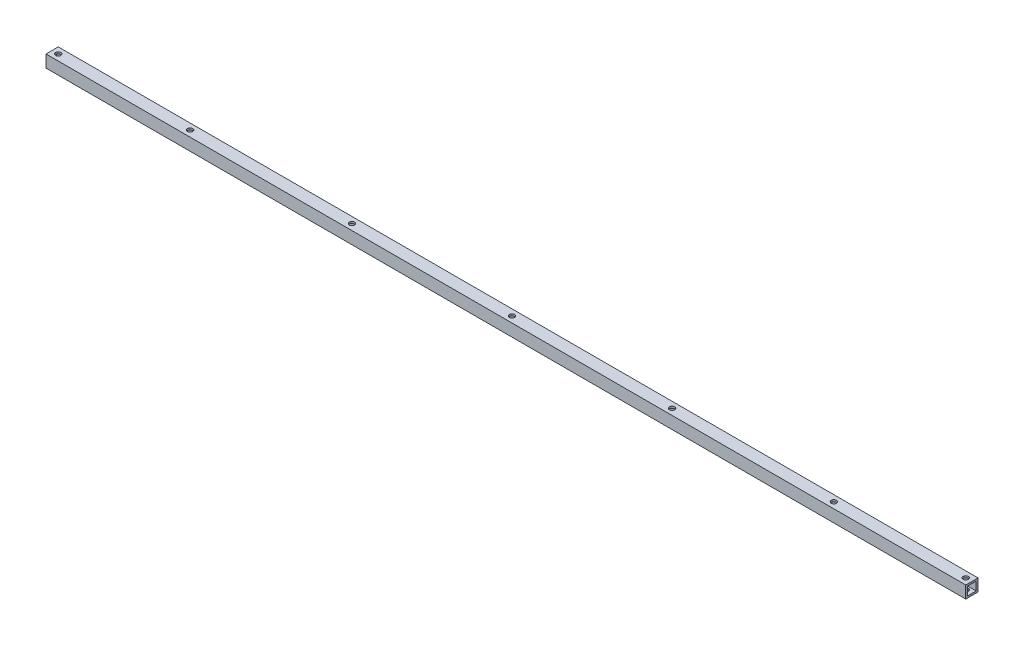
ISO-10303-21;
HEADER;
FILE_DESCRIPTION(('STEP AP214'),'2;1');
FILE_NAME('part.step','',(''),(''),'','','');
FILE_SCHEMA(('AUTOMOTIVE_DESIGN { 1 0 10303 214 1 1 1 1 }'));
ENDSEC;
DATA;
#1=APPLICATION_CONTEXT('core data for automotive mechanical design processes');
#2=APPLICATION_PROTOCOL_DEFINITION('international standard','automotive_design',2000,#1);
#3=PRODUCT_CONTEXT('',#1,'mechanical');
#4=PRODUCT('Part','Part','',(#3));
#5=PRODUCT_RELATED_PRODUCT_CATEGORY('part','',(#4));
#6=PRODUCT_DEFINITION_FORMATION('','',#4);
#7=PRODUCT_DEFINITION_CONTEXT('part definition',#1,'design');
#8=PRODUCT_DEFINITION('design','',#6,#7);
#9=PRODUCT_DEFINITION_SHAPE('','',#8);
#10=(LENGTH_UNIT() NAMED_UNIT(*) SI_UNIT(.MILLI.,.METRE.));
#11=(NAMED_UNIT(*) PLANE_ANGLE_UNIT() SI_UNIT($,.RADIAN.));
#12=(NAMED_UNIT(*) SI_UNIT($,.STERADIAN.) SOLID_ANGLE_UNIT());
#13=UNCERTAINTY_MEASURE_WITH_UNIT(LENGTH_MEASURE(1.E-05),#10,'distance_accuracy_value','');
#14=(GEOMETRIC_REPRESENTATION_CONTEXT(3) GLOBAL_UNCERTAINTY_ASSIGNED_CONTEXT((#13)) GLOBAL_UNIT_ASSIGNED_CONTEXT((#10,
#11,#12)) REPRESENTATION_CONTEXT('',''));
#15=CARTESIAN_POINT('',(0.,0.,0.));
#16=DIRECTION('',(0.,0.,1.));
#17=DIRECTION('',(1.,0.,0.));
#18=AXIS2_PLACEMENT_3D('',#15,#16,#17);
#19=CARTESIAN_POINT('',(750.,0.,0.));
#20=DIRECTION('',(1.,0.,0.));
#21=DIRECTION('',(0.,0.,-1.));
#22=AXIS2_PLACEMENT_3D('',#19,#20,#21);
#23=PLANE('',#22);
#24=DIRECTION('',(0.,1.,0.));
#25=VECTOR('',#24,1.);
#26=CARTESIAN_POINT('',(750.,5.,-5.));
#27=LINE('',#26,#25);
#28=CARTESIAN_POINT('',(750.,-5.,-5.));
#29=VERTEX_POINT('',#28);
#30=CARTESIAN_POINT('',(750.,5.,-5.));
#31=VERTEX_POINT('',#30);
#32=EDGE_CURVE('E164',#29,#31,#27,.T.);
#33=ORIENTED_EDGE('',*,*,#32,.T.);
#34=DIRECTION('',(0.,0.,1.));
#35=VECTOR('',#34,1.);
#36=CARTESIAN_POINT('',(750.,5.,5.));
#37=LINE('',#36,#35);
#38=CARTESIAN_POINT('',(750.,5.,5.));
#39=VERTEX_POINT('',#38);
#40=EDGE_CURVE('E167',#31,#39,#37,.T.);
#41=ORIENTED_EDGE('',*,*,#40,.T.);
#42=DIRECTION('',(0.,-1.,0.));
#43=VECTOR('',#42,1.);
#44=CARTESIAN_POINT('',(750.,5.,5.));
#45=LINE('',#44,#43);
#46=CARTESIAN_POINT('',(750.,-5.,5.));
#47=VERTEX_POINT('',#46);
#48=EDGE_CURVE('E170',#39,#47,#45,.T.);
#49=ORIENTED_EDGE('',*,*,#48,.T.);
#50=DIRECTION('',(0.,0.,-1.));
#51=VECTOR('',#50,1.);
#52=CARTESIAN_POINT('',(750.,-5.,5.));
#53=LINE('',#52,#51);
#54=EDGE_CURVE('E172',#47,#29,#53,.T.);
#55=ORIENTED_EDGE('',*,*,#54,.T.);
#56=EDGE_LOOP('',(#33,#41,#49,#55));
#57=FACE_BOUND('',#56,.T.);
#58=DIRECTION('',(0.,0.,1.));
#59=VECTOR('',#58,1.);
#60=CARTESIAN_POINT('',(750.,3.5,5.));
#61=LINE('',#60,#59);
#62=CARTESIAN_POINT('',(750.,3.5,-3.5));
#63=VERTEX_POINT('',#62);
#64=CARTESIAN_POINT('',(750.,3.5,3.5));
#65=VERTEX_POINT('',#64);
#66=EDGE_CURVE('E134',#63,#65,#61,.T.);
#67=ORIENTED_EDGE('',*,*,#66,.F.);
#68=DIRECTION('',(0.,1.,0.));
#69=VECTOR('',#68,1.);
#70=CARTESIAN_POINT('',(750.,5.,-3.5));
#71=LINE('',#70,#69);
#72=CARTESIAN_POINT('',(750.,-3.5,-3.5));
#73=VERTEX_POINT('',#72);
#74=EDGE_CURVE('E126',#73,#63,#71,.T.);
#75=ORIENTED_EDGE('',*,*,#74,.F.);
#76=DIRECTION('',(0.,0.,-1.));
#77=VECTOR('',#76,1.);
#78=CARTESIAN_POINT('',(750.,-3.5,5.));
#79=LINE('',#78,#77);
#80=CARTESIAN_POINT('',(750.,-3.5,3.5));
#81=VERTEX_POINT('',#80);
#82=EDGE_CURVE('E148',#81,#73,#79,.T.);
#83=ORIENTED_EDGE('',*,*,#82,.F.);
#84=DIRECTION('',(0.,-1.,0.));
#85=VECTOR('',#84,1.);
#86=CARTESIAN_POINT('',(750.,5.,3.5));
#87=LINE('',#86,#85);
#88=EDGE_CURVE('E146',#65,#81,#87,.T.);
#89=ORIENTED_EDGE('',*,*,#88,.F.);
#90=EDGE_LOOP('',(#67,#75,#83,#89));
#91=FACE_BOUND('',#90,.T.);
#92=ADVANCED_FACE('F59',(#57,#91),#23,.T.);
#93=CARTESIAN_POINT('',(0.,0.,0.));
#94=DIRECTION('',(1.,0.,0.));
#95=DIRECTION('',(0.,0.,-1.));
#96=AXIS2_PLACEMENT_3D('',#93,#94,#95);
#97=PLANE('',#96);
#98=DIRECTION('',(0.,1.,0.));
#99=VECTOR('',#98,1.);
#100=CARTESIAN_POINT('',(0.,5.,-5.));
#101=LINE('',#100,#99);
#102=CARTESIAN_POINT('',(0.,-5.,-5.));
#103=VERTEX_POINT('',#102);
#104=CARTESIAN_POINT('',(0.,5.,-5.));
#105=VERTEX_POINT('',#104);
#106=EDGE_CURVE('E142',#103,#105,#101,.T.);
#107=ORIENTED_EDGE('',*,*,#106,.F.);
#108=DIRECTION('',(0.,0.,-1.));
#109=VECTOR('',#108,1.);
#110=CARTESIAN_POINT('',(0.,-5.,5.));
#111=LINE('',#110,#109);
#112=CARTESIAN_POINT('',(0.,-5.,5.));
#113=VERTEX_POINT('',#112);
#114=EDGE_CURVE('E168',#113,#103,#111,.T.);
#115=ORIENTED_EDGE('',*,*,#114,.F.);
#116=DIRECTION('',(0.,-1.,0.));
#117=VECTOR('',#116,1.);
#118=CARTESIAN_POINT('',(0.,5.,5.));
#119=LINE('',#118,#117);
#120=CARTESIAN_POINT('',(0.,5.,5.));
#121=VERTEX_POINT('',#120);
#122=EDGE_CURVE('E179',#121,#113,#119,.T.);
#123=ORIENTED_EDGE('',*,*,#122,.F.);
#124=DIRECTION('',(0.,0.,1.));
#125=VECTOR('',#124,1.);
#126=CARTESIAN_POINT('',(0.,5.,5.));
#127=LINE('',#126,#125);
#128=EDGE_CURVE('E177',#105,#121,#127,.T.);
#129=ORIENTED_EDGE('',*,*,#128,.F.);
#130=EDGE_LOOP('',(#107,#115,#123,#129));
#131=FACE_BOUND('',#130,.T.);
#132=DIRECTION('',(0.,1.,0.));
#133=VECTOR('',#132,1.);
#134=CARTESIAN_POINT('',(0.,5.,-3.5));
#135=LINE('',#134,#133);
#136=CARTESIAN_POINT('',(0.,-3.5,-3.5));
#137=VERTEX_POINT('',#136);
#138=CARTESIAN_POINT('',(0.,3.5,-3.5));
#139=VERTEX_POINT('',#138);
#140=EDGE_CURVE('E84',#137,#139,#135,.T.);
#141=ORIENTED_EDGE('',*,*,#140,.T.);
#142=DIRECTION('',(0.,0.,1.));
#143=VECTOR('',#142,1.);
#144=CARTESIAN_POINT('',(0.,3.5,5.));
#145=LINE('',#144,#143);
#146=CARTESIAN_POINT('',(0.,3.5,3.5));
#147=VERTEX_POINT('',#146);
#148=EDGE_CURVE('E141',#139,#147,#145,.T.);
#149=ORIENTED_EDGE('',*,*,#148,.T.);
#150=DIRECTION('',(0.,-1.,0.));
#151=VECTOR('',#150,1.);
#152=CARTESIAN_POINT('',(0.,5.,3.5));
#153=LINE('',#152,#151);
#154=CARTESIAN_POINT('',(0.,-3.5,3.5));
#155=VERTEX_POINT('',#154);
#156=EDGE_CURVE('E156',#147,#155,#153,.T.);
#157=ORIENTED_EDGE('',*,*,#156,.T.);
#158=DIRECTION('',(0.,0.,-1.));
#159=VECTOR('',#158,1.);
#160=CARTESIAN_POINT('',(0.,-3.5,5.));
#161=LINE('',#160,#159);
#162=EDGE_CURVE('E135',#155,#137,#161,.T.);
#163=ORIENTED_EDGE('',*,*,#162,.T.);
#164=EDGE_LOOP('',(#141,#149,#157,#163));
#165=FACE_BOUND('',#164,.T.);
#166=ADVANCED_FACE('F249',(#131,#165),#97,.F.);
#167=CARTESIAN_POINT('',(750.,5.,-5.));
#168=DIRECTION('',(0.,0.,1.));
#169=DIRECTION('',(0.,-1.,0.));
#170=AXIS2_PLACEMENT_3D('',#167,#168,#169);
#171=PLANE('',#170);
#172=ORIENTED_EDGE('',*,*,#106,.T.);
#173=DIRECTION('',(-1.,0.,0.));
#174=VECTOR('',#173,1.);
#175=CARTESIAN_POINT('',(750.,5.,-5.));
#176=LINE('',#175,#174);
#177=EDGE_CURVE('E12',#31,#105,#176,.T.);
#178=ORIENTED_EDGE('',*,*,#177,.F.);
#179=ORIENTED_EDGE('',*,*,#32,.F.);
#180=DIRECTION('',(-1.,0.,0.));
#181=VECTOR('',#180,1.);
#182=CARTESIAN_POINT('',(750.,-5.,-5.));
#183=LINE('',#182,#181);
#184=EDGE_CURVE('E174',#29,#103,#183,.T.);
#185=ORIENTED_EDGE('',*,*,#184,.T.);
#186=EDGE_LOOP('',(#172,#178,#179,#185));
#187=FACE_BOUND('',#186,.T.);
#188=ADVANCED_FACE('F61',(#187),#171,.F.);
#189=CARTESIAN_POINT('',(750.,5.,5.));
#190=DIRECTION('',(0.,-1.,0.));
#191=DIRECTION('',(0.,0.,-1.));
#192=AXIS2_PLACEMENT_3D('',#189,#190,#191);
#193=PLANE('',#192);
#194=CARTESIAN_POINT('',(745.,5.,0.));
#195=DIRECTION('',(0.,1.,0.));
#196=DIRECTION('',(0.,0.,1.));
#197=AXIS2_PLACEMENT_3D('',#194,#195,#196);
#198=CIRCLE('',#197,2.14999999999996);
#199=CARTESIAN_POINT('',(745.,5.,2.1499999999999));
#200=VERTEX_POINT('',#199);
#201=EDGE_CURVE('E285',#200,#200,#198,.T.);
#202=ORIENTED_EDGE('',*,*,#201,.F.);
#203=EDGE_LOOP('',(#202));
#204=FACE_BOUND('',#203,.T.);
#205=CARTESIAN_POINT('',(375.,5.,0.));
#206=DIRECTION('',(0.,1.,0.));
#207=DIRECTION('',(0.,0.,1.));
#208=AXIS2_PLACEMENT_3D('',#205,#206,#207);
#209=CIRCLE('',#208,2.14999999999996);
#210=CARTESIAN_POINT('',(375.,5.,2.14999999999996));
#211=VERTEX_POINT('',#210);
#212=EDGE_CURVE('E289',#211,#211,#209,.T.);
#213=ORIENTED_EDGE('',*,*,#212,.F.);
#214=EDGE_LOOP('',(#213));
#215=FACE_BOUND('',#214,.T.);
#216=CARTESIAN_POINT('',(112.5,5.,0.));
#217=DIRECTION('',(0.,1.,0.));
#218=DIRECTION('',(0.,0.,-1.));
#219=AXIS2_PLACEMENT_3D('',#216,#217,#218);
#220=CIRCLE('',#219,2.14999999999996);
#221=CARTESIAN_POINT('',(112.5,5.,-2.14999999999988));
#222=VERTEX_POINT('',#221);
#223=EDGE_CURVE('E293',#222,#222,#220,.T.);
#224=ORIENTED_EDGE('',*,*,#223,.F.);
#225=EDGE_LOOP('',(#224));
#226=FACE_BOUND('',#225,.T.);
#227=CARTESIAN_POINT('',(5.,5.,0.));
#228=DIRECTION('',(0.,1.,0.));
#229=DIRECTION('',(0.,0.,1.));
#230=AXIS2_PLACEMENT_3D('',#227,#228,#229);
#231=CIRCLE('',#230,2.15);
#232=CARTESIAN_POINT('',(5.,5.,2.15));
#233=VERTEX_POINT('',#232);
#234=EDGE_CURVE('E297',#233,#233,#231,.T.);
#235=ORIENTED_EDGE('',*,*,#234,.F.);
#236=EDGE_LOOP('',(#235));
#237=FACE_BOUND('',#236,.T.);
#238=CARTESIAN_POINT('',(505.5,5.,0.));
#239=DIRECTION('',(0.,1.,0.));
#240=DIRECTION('',(0.,0.,1.));
#241=AXIS2_PLACEMENT_3D('',#238,#239,#240);
#242=CIRCLE('',#241,2.14999999999996);
#243=CARTESIAN_POINT('',(505.5,5.,2.14999999999999));
#244=VERTEX_POINT('',#243);
#245=EDGE_CURVE('E301',#244,#244,#242,.T.);
#246=ORIENTED_EDGE('',*,*,#245,.F.);
#247=EDGE_LOOP('',(#246));
#248=FACE_BOUND('',#247,.T.);
#249=CARTESIAN_POINT('',(244.5,5.,0.));
#250=DIRECTION('',(0.,1.,0.));
#251=DIRECTION('',(0.,0.,-1.));
#252=AXIS2_PLACEMENT_3D('',#249,#250,#251);
#253=CIRCLE('',#252,2.15000000000002);
#254=CARTESIAN_POINT('',(244.5,5.,-2.14999999999995));
#255=VERTEX_POINT('',#254);
#256=EDGE_CURVE('E305',#255,#255,#253,.T.);
#257=ORIENTED_EDGE('',*,*,#256,.F.);
#258=EDGE_LOOP('',(#257));
#259=FACE_BOUND('',#258,.T.);
#260=CARTESIAN_POINT('',(637.5,5.,0.));
#261=DIRECTION('',(0.,1.,0.));
#262=DIRECTION('',(0.,0.,1.));
#263=AXIS2_PLACEMENT_3D('',#260,#261,#262);
#264=CIRCLE('',#263,2.14999999999996);
#265=CARTESIAN_POINT('',(637.5,5.,2.14999999999997));
#266=VERTEX_POINT('',#265);
#267=EDGE_CURVE('E309',#266,#266,#264,.T.);
#268=ORIENTED_EDGE('',*,*,#267,.F.);
#269=EDGE_LOOP('',(#268));
#270=FACE_BOUND('',#269,.T.);
#271=ORIENTED_EDGE('',*,*,#128,.T.);
#272=DIRECTION('',(-1.,0.,0.));
#273=VECTOR('',#272,1.);
#274=CARTESIAN_POINT('',(750.,5.,5.));
#275=LINE('',#274,#273);
#276=EDGE_CURVE('E68',#39,#121,#275,.T.);
#277=ORIENTED_EDGE('',*,*,#276,.F.);
#278=ORIENTED_EDGE('',*,*,#40,.F.);
#279=ORIENTED_EDGE('',*,*,#177,.T.);
#280=EDGE_LOOP('',(#271,#277,#278,#279));
#281=FACE_BOUND('',#280,.T.);
#282=ADVANCED_FACE('F274',(#204,#215,#226,#237,#248,#259,#270,#281),#193,.F.);
#283=CARTESIAN_POINT('',(750.,5.,5.));
#284=DIRECTION('',(0.,0.,-1.));
#285=DIRECTION('',(0.,1.,0.));
#286=AXIS2_PLACEMENT_3D('',#283,#284,#285);
#287=PLANE('',#286);
#288=ORIENTED_EDGE('',*,*,#122,.T.);
#289=DIRECTION('',(-1.,0.,0.));
#290=VECTOR('',#289,1.);
#291=CARTESIAN_POINT('',(750.,-5.,5.));
#292=LINE('',#291,#290);
#293=EDGE_CURVE('E184',#47,#113,#292,.T.);
#294=ORIENTED_EDGE('',*,*,#293,.F.);
#295=ORIENTED_EDGE('',*,*,#48,.F.);
#296=ORIENTED_EDGE('',*,*,#276,.T.);
#297=EDGE_LOOP('',(#288,#294,#295,#296));
#298=FACE_BOUND('',#297,.T.);
#299=ADVANCED_FACE('F271',(#298),#287,.F.);
#300=CARTESIAN_POINT('',(750.,-5.,5.));
#301=DIRECTION('',(0.,1.,0.));
#302=DIRECTION('',(0.,0.,1.));
#303=AXIS2_PLACEMENT_3D('',#300,#301,#302);
#304=PLANE('',#303);
#305=CARTESIAN_POINT('',(745.,-5.,0.));
#306=DIRECTION('',(0.,1.,0.));
#307=DIRECTION('',(0.,0.,1.));
#308=AXIS2_PLACEMENT_3D('',#305,#306,#307);
#309=CIRCLE('',#308,2.14999999999996);
#310=CARTESIAN_POINT('',(745.,-5.,2.1499999999999));
#311=VERTEX_POINT('',#310);
#312=EDGE_CURVE('E193',#311,#311,#309,.T.);
#313=ORIENTED_EDGE('',*,*,#312,.T.);
#314=EDGE_LOOP('',(#313));
#315=FACE_BOUND('',#314,.T.);
#316=CARTESIAN_POINT('',(375.,-5.,0.));
#317=DIRECTION('',(0.,1.,0.));
#318=DIRECTION('',(0.,0.,1.));
#319=AXIS2_PLACEMENT_3D('',#316,#317,#318);
#320=CIRCLE('',#319,2.14999999999996);
#321=CARTESIAN_POINT('',(375.,-5.,2.14999999999996));
#322=VERTEX_POINT('',#321);
#323=EDGE_CURVE('E408',#322,#322,#320,.T.);
#324=ORIENTED_EDGE('',*,*,#323,.T.);
#325=EDGE_LOOP('',(#324));
#326=FACE_BOUND('',#325,.T.);
#327=CARTESIAN_POINT('',(112.5,-5.,0.));
#328=DIRECTION('',(0.,1.,0.));
#329=DIRECTION('',(0.,0.,-1.));
#330=AXIS2_PLACEMENT_3D('',#327,#328,#329);
#331=CIRCLE('',#330,2.14999999999996);
#332=CARTESIAN_POINT('',(112.5,-5.,-2.14999999999988));
#333=VERTEX_POINT('',#332);
#334=EDGE_CURVE('E323',#333,#333,#331,.T.);
#335=ORIENTED_EDGE('',*,*,#334,.T.);
#336=EDGE_LOOP('',(#335));
#337=FACE_BOUND('',#336,.T.);
#338=CARTESIAN_POINT('',(5.,-5.,0.));
#339=DIRECTION('',(0.,1.,0.));
#340=DIRECTION('',(0.,0.,1.));
#341=AXIS2_PLACEMENT_3D('',#338,#339,#340);
#342=CIRCLE('',#341,2.15);
#343=CARTESIAN_POINT('',(5.,-5.,2.15));
#344=VERTEX_POINT('',#343);
#345=EDGE_CURVE('E331',#344,#344,#342,.T.);
#346=ORIENTED_EDGE('',*,*,#345,.T.);
#347=EDGE_LOOP('',(#346));
#348=FACE_BOUND('',#347,.T.);
#349=CARTESIAN_POINT('',(505.5,-5.,0.));
#350=DIRECTION('',(0.,1.,0.));
#351=DIRECTION('',(0.,0.,1.));
#352=AXIS2_PLACEMENT_3D('',#349,#350,#351);
#353=CIRCLE('',#352,2.14999999999996);
#354=CARTESIAN_POINT('',(505.5,-5.,2.14999999999999));
#355=VERTEX_POINT('',#354);
#356=EDGE_CURVE('E335',#355,#355,#353,.T.);
#357=ORIENTED_EDGE('',*,*,#356,.T.);
#358=EDGE_LOOP('',(#357));
#359=FACE_BOUND('',#358,.T.);
#360=CARTESIAN_POINT('',(244.5,-5.,0.));
#361=DIRECTION('',(0.,1.,0.));
#362=DIRECTION('',(0.,0.,-1.));
#363=AXIS2_PLACEMENT_3D('',#360,#361,#362);
#364=CIRCLE('',#363,2.15000000000002);
#365=CARTESIAN_POINT('',(244.5,-5.,-2.14999999999996));
#366=VERTEX_POINT('',#365);
#367=EDGE_CURVE('E339',#366,#366,#364,.T.);
#368=ORIENTED_EDGE('',*,*,#367,.T.);
#369=EDGE_LOOP('',(#368));
#370=FACE_BOUND('',#369,.T.);
#371=CARTESIAN_POINT('',(637.5,-5.,0.));
#372=DIRECTION('',(0.,1.,0.));
#373=DIRECTION('',(0.,0.,1.));
#374=AXIS2_PLACEMENT_3D('',#371,#372,#373);
#375=CIRCLE('',#374,2.14999999999996);
#376=CARTESIAN_POINT('',(637.5,-5.,2.14999999999997));
#377=VERTEX_POINT('',#376);
#378=EDGE_CURVE('E322',#377,#377,#375,.T.);
#379=ORIENTED_EDGE('',*,*,#378,.T.);
#380=EDGE_LOOP('',(#379));
#381=FACE_BOUND('',#380,.T.);
#382=ORIENTED_EDGE('',*,*,#114,.T.);
#383=ORIENTED_EDGE('',*,*,#184,.F.);
#384=ORIENTED_EDGE('',*,*,#54,.F.);
#385=ORIENTED_EDGE('',*,*,#293,.T.);
#386=EDGE_LOOP('',(#382,#383,#384,#385));
#387=FACE_BOUND('',#386,.T.);
#388=ADVANCED_FACE('F268',(#315,#326,#337,#348,#359,#370,#381,#387),#304,.F.);
#389=CARTESIAN_POINT('',(750.,5.,-3.5));
#390=DIRECTION('',(0.,0.,1.));
#391=DIRECTION('',(0.,-1.,0.));
#392=AXIS2_PLACEMENT_3D('',#389,#390,#391);
#393=PLANE('',#392);
#394=ORIENTED_EDGE('',*,*,#140,.F.);
#395=DIRECTION('',(-1.,0.,0.));
#396=VECTOR('',#395,1.);
#397=CARTESIAN_POINT('',(750.,-3.5,-3.5));
#398=LINE('',#397,#396);
#399=EDGE_CURVE('E130',#73,#137,#398,.T.);
#400=ORIENTED_EDGE('',*,*,#399,.F.);
#401=ORIENTED_EDGE('',*,*,#74,.T.);
#402=DIRECTION('',(-1.,0.,0.));
#403=VECTOR('',#402,1.);
#404=CARTESIAN_POINT('',(750.,3.5,-3.5));
#405=LINE('',#404,#403);
#406=EDGE_CURVE('E129',#63,#139,#405,.T.);
#407=ORIENTED_EDGE('',*,*,#406,.T.);
#408=EDGE_LOOP('',(#394,#400,#401,#407));
#409=FACE_BOUND('',#408,.T.);
#410=ADVANCED_FACE('F128',(#409),#393,.T.);
#411=CARTESIAN_POINT('',(750.,3.5,5.));
#412=DIRECTION('',(0.,-1.,0.));
#413=DIRECTION('',(0.,0.,-1.));
#414=AXIS2_PLACEMENT_3D('',#411,#412,#413);
#415=PLANE('',#414);
#416=CARTESIAN_POINT('',(745.,3.5,0.));
#417=DIRECTION('',(0.,-1.,0.));
#418=DIRECTION('',(0.,0.,-1.));
#419=AXIS2_PLACEMENT_3D('',#416,#417,#418);
#420=CIRCLE('',#419,2.14999999999996);
#421=CARTESIAN_POINT('',(745.,3.5,-2.15000000000002));
#422=VERTEX_POINT('',#421);
#423=EDGE_CURVE('E154',#422,#422,#420,.T.);
#424=ORIENTED_EDGE('',*,*,#423,.F.);
#425=EDGE_LOOP('',(#424));
#426=FACE_BOUND('',#425,.T.);
#427=CARTESIAN_POINT('',(375.,3.5,0.));
#428=DIRECTION('',(0.,-1.,0.));
#429=DIRECTION('',(0.,0.,-1.));
#430=AXIS2_PLACEMENT_3D('',#427,#428,#429);
#431=CIRCLE('',#430,2.14999999999996);
#432=CARTESIAN_POINT('',(375.,3.5,-2.14999999999996));
#433=VERTEX_POINT('',#432);
#434=EDGE_CURVE('E211',#433,#433,#431,.T.);
#435=ORIENTED_EDGE('',*,*,#434,.F.);
#436=EDGE_LOOP('',(#435));
#437=FACE_BOUND('',#436,.T.);
#438=CARTESIAN_POINT('',(112.5,3.5,0.));
#439=DIRECTION('',(0.,-1.,0.));
#440=DIRECTION('',(0.,0.,-1.));
#441=AXIS2_PLACEMENT_3D('',#438,#439,#440);
#442=CIRCLE('',#441,2.14999999999996);
#443=CARTESIAN_POINT('',(112.5,3.5,-2.14999999999988));
#444=VERTEX_POINT('',#443);
#445=EDGE_CURVE('E208',#444,#444,#442,.T.);
#446=ORIENTED_EDGE('',*,*,#445,.F.);
#447=EDGE_LOOP('',(#446));
#448=FACE_BOUND('',#447,.T.);
#449=CARTESIAN_POINT('',(5.,3.5,0.));
#450=DIRECTION('',(0.,-1.,0.));
#451=DIRECTION('',(0.,0.,-1.));
#452=AXIS2_PLACEMENT_3D('',#449,#450,#451);
#453=CIRCLE('',#452,2.15);
#454=CARTESIAN_POINT('',(5.,3.5,-2.15));
#455=VERTEX_POINT('',#454);
#456=EDGE_CURVE('E205',#455,#455,#453,.T.);
#457=ORIENTED_EDGE('',*,*,#456,.F.);
#458=EDGE_LOOP('',(#457));
#459=FACE_BOUND('',#458,.T.);
#460=CARTESIAN_POINT('',(505.5,3.5,0.));
#461=DIRECTION('',(0.,-1.,0.));
#462=DIRECTION('',(0.,0.,-1.));
#463=AXIS2_PLACEMENT_3D('',#460,#461,#462);
#464=CIRCLE('',#463,2.14999999999996);
#465=CARTESIAN_POINT('',(505.5,3.5,-2.14999999999993));
#466=VERTEX_POINT('',#465);
#467=EDGE_CURVE('E201',#466,#466,#464,.T.);
#468=ORIENTED_EDGE('',*,*,#467,.F.);
#469=EDGE_LOOP('',(#468));
#470=FACE_BOUND('',#469,.T.);
#471=CARTESIAN_POINT('',(244.5,3.5,0.));
#472=DIRECTION('',(0.,-1.,0.));
#473=DIRECTION('',(0.,0.,-1.));
#474=AXIS2_PLACEMENT_3D('',#471,#472,#473);
#475=CIRCLE('',#474,2.15000000000002);
#476=CARTESIAN_POINT('',(244.5,3.5,-2.14999999999995));
#477=VERTEX_POINT('',#476);
#478=EDGE_CURVE('E197',#477,#477,#475,.T.);
#479=ORIENTED_EDGE('',*,*,#478,.F.);
#480=EDGE_LOOP('',(#479));
#481=FACE_BOUND('',#480,.T.);
#482=CARTESIAN_POINT('',(637.5,3.5,0.));
#483=DIRECTION('',(0.,-1.,0.));
#484=DIRECTION('',(0.,0.,-1.));
#485=AXIS2_PLACEMENT_3D('',#482,#483,#484);
#486=CIRCLE('',#485,2.14999999999996);
#487=CARTESIAN_POINT('',(637.5,3.5,-2.14999999999995));
#488=VERTEX_POINT('',#487);
#489=EDGE_CURVE('E192',#488,#488,#486,.T.);
#490=ORIENTED_EDGE('',*,*,#489,.F.);
#491=EDGE_LOOP('',(#490));
#492=FACE_BOUND('',#491,.T.);
#493=ORIENTED_EDGE('',*,*,#148,.F.);
#494=ORIENTED_EDGE('',*,*,#406,.F.);
#495=ORIENTED_EDGE('',*,*,#66,.T.);
#496=DIRECTION('',(-1.,0.,0.));
#497=VECTOR('',#496,1.);
#498=CARTESIAN_POINT('',(750.,3.5,3.5));
#499=LINE('',#498,#497);
#500=EDGE_CURVE('E143',#65,#147,#499,.T.);
#501=ORIENTED_EDGE('',*,*,#500,.T.);
#502=EDGE_LOOP('',(#493,#494,#495,#501));
#503=FACE_BOUND('',#502,.T.);
#504=ADVANCED_FACE('F138',(#426,#437,#448,#459,#470,#481,#492,#503),#415,.T.);
#505=CARTESIAN_POINT('',(750.,5.,3.5));
#506=DIRECTION('',(0.,0.,-1.));
#507=DIRECTION('',(0.,1.,0.));
#508=AXIS2_PLACEMENT_3D('',#505,#506,#507);
#509=PLANE('',#508);
#510=ORIENTED_EDGE('',*,*,#156,.F.);
#511=ORIENTED_EDGE('',*,*,#500,.F.);
#512=ORIENTED_EDGE('',*,*,#88,.T.);
#513=DIRECTION('',(-1.,0.,0.));
#514=VECTOR('',#513,1.);
#515=CARTESIAN_POINT('',(750.,-3.5,3.5));
#516=LINE('',#515,#514);
#517=EDGE_CURVE('E76',#81,#155,#516,.T.);
#518=ORIENTED_EDGE('',*,*,#517,.T.);
#519=EDGE_LOOP('',(#510,#511,#512,#518));
#520=FACE_BOUND('',#519,.T.);
#521=ADVANCED_FACE('F235',(#520),#509,.T.);
#522=CARTESIAN_POINT('',(750.,-3.5,5.));
#523=DIRECTION('',(0.,1.,0.));
#524=DIRECTION('',(0.,0.,1.));
#525=AXIS2_PLACEMENT_3D('',#522,#523,#524);
#526=PLANE('',#525);
#527=CARTESIAN_POINT('',(745.,-3.5,0.));
#528=DIRECTION('',(0.,1.,0.));
#529=DIRECTION('',(0.,0.,1.));
#530=AXIS2_PLACEMENT_3D('',#527,#528,#529);
#531=CIRCLE('',#530,2.14999999999996);
#532=CARTESIAN_POINT('',(745.,-3.5,2.1499999999999));
#533=VERTEX_POINT('',#532);
#534=EDGE_CURVE('E63',#533,#533,#531,.T.);
#535=ORIENTED_EDGE('',*,*,#534,.F.);
#536=EDGE_LOOP('',(#535));
#537=FACE_BOUND('',#536,.T.);
#538=CARTESIAN_POINT('',(375.,-3.5,0.));
#539=DIRECTION('',(0.,1.,0.));
#540=DIRECTION('',(0.,0.,1.));
#541=AXIS2_PLACEMENT_3D('',#538,#539,#540);
#542=CIRCLE('',#541,2.14999999999996);
#543=CARTESIAN_POINT('',(375.,-3.5,2.14999999999996));
#544=VERTEX_POINT('',#543);
#545=EDGE_CURVE('E209',#544,#544,#542,.T.);
#546=ORIENTED_EDGE('',*,*,#545,.F.);
#547=EDGE_LOOP('',(#546));
#548=FACE_BOUND('',#547,.T.);
#549=CARTESIAN_POINT('',(112.5,-3.5,0.));
#550=DIRECTION('',(0.,1.,0.));
#551=DIRECTION('',(0.,0.,1.));
#552=AXIS2_PLACEMENT_3D('',#549,#550,#551);
#553=CIRCLE('',#552,2.14999999999996);
#554=CARTESIAN_POINT('',(112.5,-3.5,2.15000000000003));
#555=VERTEX_POINT('',#554);
#556=EDGE_CURVE('E206',#555,#555,#553,.T.);
#557=ORIENTED_EDGE('',*,*,#556,.F.);
#558=EDGE_LOOP('',(#557));
#559=FACE_BOUND('',#558,.T.);
#560=CARTESIAN_POINT('',(5.,-3.5,0.));
#561=DIRECTION('',(0.,1.,0.));
#562=DIRECTION('',(0.,0.,1.));
#563=AXIS2_PLACEMENT_3D('',#560,#561,#562);
#564=CIRCLE('',#563,2.15);
#565=CARTESIAN_POINT('',(5.,-3.5,2.15));
#566=VERTEX_POINT('',#565);
#567=EDGE_CURVE('E202',#566,#566,#564,.T.);
#568=ORIENTED_EDGE('',*,*,#567,.F.);
#569=EDGE_LOOP('',(#568));
#570=FACE_BOUND('',#569,.T.);
#571=CARTESIAN_POINT('',(505.5,-3.5,0.));
#572=DIRECTION('',(0.,1.,0.));
#573=DIRECTION('',(0.,0.,1.));
#574=AXIS2_PLACEMENT_3D('',#571,#572,#573);
#575=CIRCLE('',#574,2.14999999999996);
#576=CARTESIAN_POINT('',(505.5,-3.5,2.14999999999999));
#577=VERTEX_POINT('',#576);
#578=EDGE_CURVE('E198',#577,#577,#575,.T.);
#579=ORIENTED_EDGE('',*,*,#578,.F.);
#580=EDGE_LOOP('',(#579));
#581=FACE_BOUND('',#580,.T.);
#582=CARTESIAN_POINT('',(244.5,-3.5,0.));
#583=DIRECTION('',(0.,1.,0.));
#584=DIRECTION('',(0.,0.,1.));
#585=AXIS2_PLACEMENT_3D('',#582,#583,#584);
#586=CIRCLE('',#585,2.15000000000002);
#587=CARTESIAN_POINT('',(244.5,-3.5,2.15000000000008));
#588=VERTEX_POINT('',#587);
#589=EDGE_CURVE('E194',#588,#588,#586,.T.);
#590=ORIENTED_EDGE('',*,*,#589,.F.);
#591=EDGE_LOOP('',(#590));
#592=FACE_BOUND('',#591,.T.);
#593=CARTESIAN_POINT('',(637.5,-3.5,0.));
#594=DIRECTION('',(0.,1.,0.));
#595=DIRECTION('',(0.,0.,1.));
#596=AXIS2_PLACEMENT_3D('',#593,#594,#595);
#597=CIRCLE('',#596,2.14999999999996);
#598=CARTESIAN_POINT('',(637.5,-3.5,2.14999999999997));
#599=VERTEX_POINT('',#598);
#600=EDGE_CURVE('E189',#599,#599,#597,.T.);
#601=ORIENTED_EDGE('',*,*,#600,.F.);
#602=EDGE_LOOP('',(#601));
#603=FACE_BOUND('',#602,.T.);
#604=ORIENTED_EDGE('',*,*,#162,.F.);
#605=ORIENTED_EDGE('',*,*,#517,.F.);
#606=ORIENTED_EDGE('',*,*,#82,.T.);
#607=ORIENTED_EDGE('',*,*,#399,.T.);
#608=EDGE_LOOP('',(#604,#605,#606,#607));
#609=FACE_BOUND('',#608,.T.);
#610=ADVANCED_FACE('F231',(#537,#548,#559,#570,#581,#592,#603,#609),#526,.T.);
#611=CARTESIAN_POINT('',(637.5,-5.,0.));
#612=DIRECTION('',(0.,1.,0.));
#613=DIRECTION('',(0.,0.,1.));
#614=AXIS2_PLACEMENT_3D('',#611,#612,#613);
#615=CYLINDRICAL_SURFACE('',#614,2.14999999999996);
#616=ORIENTED_EDGE('',*,*,#600,.T.);
#617=EDGE_LOOP('',(#616));
#618=FACE_BOUND('',#617,.T.);
#619=ORIENTED_EDGE('',*,*,#378,.F.);
#620=EDGE_LOOP('',(#619));
#621=FACE_BOUND('',#620,.T.);
#622=ADVANCED_FACE('F234',(#618,#621),#615,.F.);
#623=CARTESIAN_POINT('',(244.5,-5.,0.));
#624=DIRECTION('',(0.,1.,0.));
#625=DIRECTION('',(0.,0.,1.));
#626=AXIS2_PLACEMENT_3D('',#623,#624,#625);
#627=CYLINDRICAL_SURFACE('',#626,2.15000000000002);
#628=ORIENTED_EDGE('',*,*,#589,.T.);
#629=EDGE_LOOP('',(#628));
#630=FACE_BOUND('',#629,.T.);
#631=ORIENTED_EDGE('',*,*,#367,.F.);
#632=EDGE_LOOP('',(#631));
#633=FACE_BOUND('',#632,.T.);
#634=ADVANCED_FACE('F364',(#630,#633),#627,.F.);
#635=CARTESIAN_POINT('',(505.5,-5.,0.));
#636=DIRECTION('',(0.,1.,0.));
#637=DIRECTION('',(0.,0.,1.));
#638=AXIS2_PLACEMENT_3D('',#635,#636,#637);
#639=CYLINDRICAL_SURFACE('',#638,2.14999999999996);
#640=ORIENTED_EDGE('',*,*,#578,.T.);
#641=EDGE_LOOP('',(#640));
#642=FACE_BOUND('',#641,.T.);
#643=ORIENTED_EDGE('',*,*,#356,.F.);
#644=EDGE_LOOP('',(#643));
#645=FACE_BOUND('',#644,.T.);
#646=ADVANCED_FACE('F374',(#642,#645),#639,.F.);
#647=CARTESIAN_POINT('',(5.,-5.,0.));
#648=DIRECTION('',(0.,1.,0.));
#649=DIRECTION('',(0.,0.,1.));
#650=AXIS2_PLACEMENT_3D('',#647,#648,#649);
#651=CYLINDRICAL_SURFACE('',#650,2.15);
#652=ORIENTED_EDGE('',*,*,#567,.T.);
#653=EDGE_LOOP('',(#652));
#654=FACE_BOUND('',#653,.T.);
#655=ORIENTED_EDGE('',*,*,#345,.F.);
#656=EDGE_LOOP('',(#655));
#657=FACE_BOUND('',#656,.T.);
#658=ADVANCED_FACE('F382',(#654,#657),#651,.F.);
#659=CARTESIAN_POINT('',(112.5,-5.,0.));
#660=DIRECTION('',(0.,1.,0.));
#661=DIRECTION('',(0.,0.,1.));
#662=AXIS2_PLACEMENT_3D('',#659,#660,#661);
#663=CYLINDRICAL_SURFACE('',#662,2.14999999999996);
#664=ORIENTED_EDGE('',*,*,#556,.T.);
#665=EDGE_LOOP('',(#664));
#666=FACE_BOUND('',#665,.T.);
#667=ORIENTED_EDGE('',*,*,#334,.F.);
#668=EDGE_LOOP('',(#667));
#669=FACE_BOUND('',#668,.T.);
#670=ADVANCED_FACE('F389',(#666,#669),#663,.F.);
#671=CARTESIAN_POINT('',(375.,-5.,0.));
#672=DIRECTION('',(0.,1.,0.));
#673=DIRECTION('',(0.,0.,1.));
#674=AXIS2_PLACEMENT_3D('',#671,#672,#673);
#675=CYLINDRICAL_SURFACE('',#674,2.14999999999996);
#676=ORIENTED_EDGE('',*,*,#545,.T.);
#677=EDGE_LOOP('',(#676));
#678=FACE_BOUND('',#677,.T.);
#679=ORIENTED_EDGE('',*,*,#323,.F.);
#680=EDGE_LOOP('',(#679));
#681=FACE_BOUND('',#680,.T.);
#682=ADVANCED_FACE('F365',(#678,#681),#675,.F.);
#683=CARTESIAN_POINT('',(745.,-5.,0.));
#684=DIRECTION('',(0.,1.,0.));
#685=DIRECTION('',(0.,0.,1.));
#686=AXIS2_PLACEMENT_3D('',#683,#684,#685);
#687=CYLINDRICAL_SURFACE('',#686,2.14999999999996);
#688=ORIENTED_EDGE('',*,*,#534,.T.);
#689=EDGE_LOOP('',(#688));
#690=FACE_BOUND('',#689,.T.);
#691=ORIENTED_EDGE('',*,*,#312,.F.);
#692=EDGE_LOOP('',(#691));
#693=FACE_BOUND('',#692,.T.);
#694=ADVANCED_FACE('F228',(#690,#693),#687,.F.);
#695=ORIENTED_EDGE('',*,*,#489,.T.);
#696=EDGE_LOOP('',(#695));
#697=FACE_BOUND('',#696,.T.);
#698=ORIENTED_EDGE('',*,*,#267,.T.);
#699=EDGE_LOOP('',(#698));
#700=FACE_BOUND('',#699,.T.);
#701=ADVANCED_FACE('F354',(#697,#700),#615,.F.);
#702=ORIENTED_EDGE('',*,*,#478,.T.);
#703=EDGE_LOOP('',(#702));
#704=FACE_BOUND('',#703,.T.);
#705=ORIENTED_EDGE('',*,*,#256,.T.);
#706=EDGE_LOOP('',(#705));
#707=FACE_BOUND('',#706,.T.);
#708=ADVANCED_FACE('F356',(#704,#707),#627,.F.);
#709=ORIENTED_EDGE('',*,*,#467,.T.);
#710=EDGE_LOOP('',(#709));
#711=FACE_BOUND('',#710,.T.);
#712=ORIENTED_EDGE('',*,*,#245,.T.);
#713=EDGE_LOOP('',(#712));
#714=FACE_BOUND('',#713,.T.);
#715=ADVANCED_FACE('F346',(#711,#714),#639,.F.);
#716=ORIENTED_EDGE('',*,*,#456,.T.);
#717=EDGE_LOOP('',(#716));
#718=FACE_BOUND('',#717,.T.);
#719=ORIENTED_EDGE('',*,*,#234,.T.);
#720=EDGE_LOOP('',(#719));
#721=FACE_BOUND('',#720,.T.);
#722=ADVANCED_FACE('F398',(#718,#721),#651,.F.);
#723=ORIENTED_EDGE('',*,*,#445,.T.);
#724=EDGE_LOOP('',(#723));
#725=FACE_BOUND('',#724,.T.);
#726=ORIENTED_EDGE('',*,*,#223,.T.);
#727=EDGE_LOOP('',(#726));
#728=FACE_BOUND('',#727,.T.);
#729=ADVANCED_FACE('F393',(#725,#728),#663,.F.);
#730=ORIENTED_EDGE('',*,*,#434,.T.);
#731=EDGE_LOOP('',(#730));
#732=FACE_BOUND('',#731,.T.);
#733=ORIENTED_EDGE('',*,*,#212,.T.);
#734=EDGE_LOOP('',(#733));
#735=FACE_BOUND('',#734,.T.);
#736=ADVANCED_FACE('F390',(#732,#735),#675,.F.);
#737=ORIENTED_EDGE('',*,*,#423,.T.);
#738=EDGE_LOOP('',(#737));
#739=FACE_BOUND('',#738,.T.);
#740=ORIENTED_EDGE('',*,*,#201,.T.);
#741=EDGE_LOOP('',(#740));
#742=FACE_BOUND('',#741,.T.);
#743=ADVANCED_FACE('F367',(#739,#742),#687,.F.);
#744=CLOSED_SHELL('',(#92,#166,#188,#282,#299,#388,#410,#504,#521,#610,#622,#634,#646,#658,#670,
#682,#694,#701,#708,#715,#722,#729,#736,#743));
#745=MANIFOLD_SOLID_BREP('B2',#744);
#746=ADVANCED_BREP_SHAPE_REPRESENTATION('',(#18,#745),#14);
#747=SHAPE_DEFINITION_REPRESENTATION(#9,#746);
ENDSEC;
END-ISO-10303-21;
